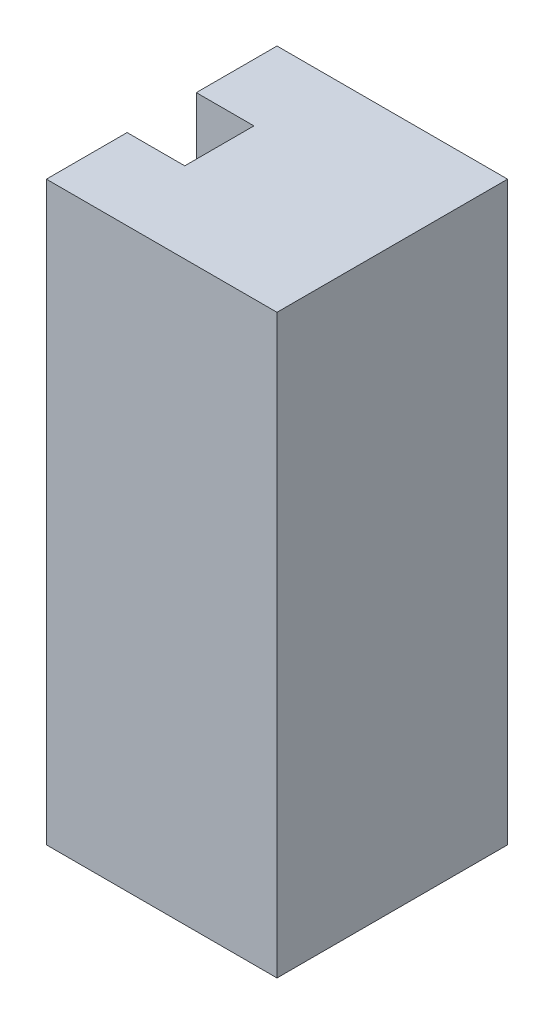
ISO-10303-21;
HEADER;
FILE_DESCRIPTION(('STEP AP214'),'2;1');
FILE_NAME('part.step','',(''),(''),'','','');
FILE_SCHEMA(('AUTOMOTIVE_DESIGN { 1 0 10303 214 1 1 1 1 }'));
ENDSEC;
DATA;
#1=APPLICATION_CONTEXT('core data for automotive mechanical design processes');
#2=APPLICATION_PROTOCOL_DEFINITION('international standard','automotive_design',2000,#1);
#3=PRODUCT_CONTEXT('',#1,'mechanical');
#4=PRODUCT('Part','Part','',(#3));
#5=PRODUCT_RELATED_PRODUCT_CATEGORY('part','',(#4));
#6=PRODUCT_DEFINITION_FORMATION('','',#4);
#7=PRODUCT_DEFINITION_CONTEXT('part definition',#1,'design');
#8=PRODUCT_DEFINITION('design','',#6,#7);
#9=PRODUCT_DEFINITION_SHAPE('','',#8);
#10=(LENGTH_UNIT() NAMED_UNIT(*) SI_UNIT(.MILLI.,.METRE.));
#11=(NAMED_UNIT(*) PLANE_ANGLE_UNIT() SI_UNIT($,.RADIAN.));
#12=(NAMED_UNIT(*) SI_UNIT($,.STERADIAN.) SOLID_ANGLE_UNIT());
#13=UNCERTAINTY_MEASURE_WITH_UNIT(LENGTH_MEASURE(1.E-05),#10,'distance_accuracy_value','');
#14=(GEOMETRIC_REPRESENTATION_CONTEXT(3) GLOBAL_UNCERTAINTY_ASSIGNED_CONTEXT((#13)) GLOBAL_UNIT_ASSIGNED_CONTEXT((#10,
#11,#12)) REPRESENTATION_CONTEXT('',''));
#15=CARTESIAN_POINT('',(0.,0.,0.));
#16=DIRECTION('',(0.,0.,1.));
#17=DIRECTION('',(1.,0.,0.));
#18=AXIS2_PLACEMENT_3D('',#15,#16,#17);
#19=CARTESIAN_POINT('',(-8.77887788778878,50.,-3.86138613861386));
#20=DIRECTION('',(1.,0.,0.));
#21=DIRECTION('',(0.,0.,-1.));
#22=AXIS2_PLACEMENT_3D('',#19,#20,#21);
#23=PLANE('',#22);
#24=DIRECTION('',(0.,0.,1.));
#25=VECTOR('',#24,1.);
#26=CARTESIAN_POINT('',(-8.77887788778878,50.,-3.86138613861386));
#27=LINE('',#26,#25);
#28=CARTESIAN_POINT('',(-8.77887788778878,50.,9.13861386138614));
#29=VERTEX_POINT('',#28);
#30=CARTESIAN_POINT('',(-8.77887788778877,50.,16.1386138613861));
#31=VERTEX_POINT('',#30);
#32=EDGE_CURVE('E91',#29,#31,#27,.T.);
#33=ORIENTED_EDGE('',*,*,#32,.F.);
#34=DIRECTION('',(0.,1.,0.));
#35=VECTOR('',#34,1.);
#36=CARTESIAN_POINT('',(-8.77887788778878,50.,9.13861386138614));
#37=LINE('',#36,#35);
#38=CARTESIAN_POINT('',(-8.77887788778878,0.,9.13861386138614));
#39=VERTEX_POINT('',#38);
#40=EDGE_CURVE('E118',#39,#29,#37,.T.);
#41=ORIENTED_EDGE('',*,*,#40,.F.);
#42=DIRECTION('',(0.,0.,1.));
#43=VECTOR('',#42,1.);
#44=CARTESIAN_POINT('',(-8.77887788778878,0.,-3.86138613861386));
#45=LINE('',#44,#43);
#46=CARTESIAN_POINT('',(-8.77887788778877,0.,16.1386138613861));
#47=VERTEX_POINT('',#46);
#48=EDGE_CURVE('E139',#39,#47,#45,.T.);
#49=ORIENTED_EDGE('',*,*,#48,.T.);
#50=DIRECTION('',(0.,-1.,0.));
#51=VECTOR('',#50,1.);
#52=CARTESIAN_POINT('',(-8.77887788778877,50.,16.1386138613861));
#53=LINE('',#52,#51);
#54=EDGE_CURVE('E11',#31,#47,#53,.T.);
#55=ORIENTED_EDGE('',*,*,#54,.F.);
#56=EDGE_LOOP('',(#33,#41,#49,#55));
#57=FACE_BOUND('',#56,.T.);
#58=ADVANCED_FACE('F39',(#57),#23,.F.);
#59=CARTESIAN_POINT('',(-8.77887788778878,0.,-3.86138613861386));
#60=VERTEX_POINT('',#59);
#61=CARTESIAN_POINT('',(-8.77887788778878,0.,3.13861386138614));
#62=VERTEX_POINT('',#61);
#63=EDGE_CURVE('E152',#60,#62,#45,.T.);
#64=ORIENTED_EDGE('',*,*,#63,.T.);
#65=DIRECTION('',(0.,-1.,0.));
#66=VECTOR('',#65,1.);
#67=CARTESIAN_POINT('',(-8.77887788778878,50.,3.13861386138614));
#68=LINE('',#67,#66);
#69=CARTESIAN_POINT('',(-8.77887788778878,50.,3.13861386138614));
#70=VERTEX_POINT('',#69);
#71=EDGE_CURVE('E128',#70,#62,#68,.T.);
#72=ORIENTED_EDGE('',*,*,#71,.F.);
#73=CARTESIAN_POINT('',(-8.77887788778878,50.,-3.86138613861386));
#74=VERTEX_POINT('',#73);
#75=EDGE_CURVE('E144',#74,#70,#27,.T.);
#76=ORIENTED_EDGE('',*,*,#75,.F.);
#77=DIRECTION('',(0.,-1.,0.));
#78=VECTOR('',#77,1.);
#79=CARTESIAN_POINT('',(-8.77887788778878,50.,-3.86138613861386));
#80=LINE('',#79,#78);
#81=EDGE_CURVE('E151',#74,#60,#80,.T.);
#82=ORIENTED_EDGE('',*,*,#81,.T.);
#83=EDGE_LOOP('',(#64,#72,#76,#82));
#84=FACE_BOUND('',#83,.T.);
#85=ADVANCED_FACE('F41',(#84),#23,.F.);
#86=CARTESIAN_POINT('',(-8.77887788778877,50.,16.1386138613861));
#87=DIRECTION('',(0.,0.,-1.));
#88=DIRECTION('',(-1.,0.,0.));
#89=AXIS2_PLACEMENT_3D('',#86,#87,#88);
#90=PLANE('',#89);
#91=DIRECTION('',(1.,0.,0.));
#92=VECTOR('',#91,1.);
#93=CARTESIAN_POINT('',(-8.77887788778877,0.,16.1386138613861));
#94=LINE('',#93,#92);
#95=CARTESIAN_POINT('',(11.2211221122112,0.,16.1386138613861));
#96=VERTEX_POINT('',#95);
#97=EDGE_CURVE('E155',#47,#96,#94,.T.);
#98=ORIENTED_EDGE('',*,*,#97,.T.);
#99=DIRECTION('',(0.,-1.,0.));
#100=VECTOR('',#99,1.);
#101=CARTESIAN_POINT('',(11.2211221122112,50.,16.1386138613861));
#102=LINE('',#101,#100);
#103=CARTESIAN_POINT('',(11.2211221122112,50.,16.1386138613861));
#104=VERTEX_POINT('',#103);
#105=EDGE_CURVE('E47',#104,#96,#102,.T.);
#106=ORIENTED_EDGE('',*,*,#105,.F.);
#107=DIRECTION('',(1.,0.,0.));
#108=VECTOR('',#107,1.);
#109=CARTESIAN_POINT('',(-8.77887788778877,50.,16.1386138613861));
#110=LINE('',#109,#108);
#111=EDGE_CURVE('E146',#31,#104,#110,.T.);
#112=ORIENTED_EDGE('',*,*,#111,.F.);
#113=ORIENTED_EDGE('',*,*,#54,.T.);
#114=EDGE_LOOP('',(#98,#106,#112,#113));
#115=FACE_BOUND('',#114,.T.);
#116=ADVANCED_FACE('F187',(#115),#90,.F.);
#117=CARTESIAN_POINT('',(11.2211221122112,50.,-3.86138613861386));
#118=DIRECTION('',(-1.,0.,0.));
#119=DIRECTION('',(0.,0.,1.));
#120=AXIS2_PLACEMENT_3D('',#117,#118,#119);
#121=PLANE('',#120);
#122=DIRECTION('',(0.,0.,-1.));
#123=VECTOR('',#122,1.);
#124=CARTESIAN_POINT('',(11.2211221122112,0.,-3.86138613861386));
#125=LINE('',#124,#123);
#126=CARTESIAN_POINT('',(11.2211221122112,0.,-3.86138613861386));
#127=VERTEX_POINT('',#126);
#128=EDGE_CURVE('E157',#96,#127,#125,.T.);
#129=ORIENTED_EDGE('',*,*,#128,.T.);
#130=DIRECTION('',(0.,-1.,0.));
#131=VECTOR('',#130,1.);
#132=CARTESIAN_POINT('',(11.2211221122112,50.,-3.86138613861386));
#133=LINE('',#132,#131);
#134=CARTESIAN_POINT('',(11.2211221122112,50.,-3.86138613861386));
#135=VERTEX_POINT('',#134);
#136=EDGE_CURVE('E161',#135,#127,#133,.T.);
#137=ORIENTED_EDGE('',*,*,#136,.F.);
#138=DIRECTION('',(0.,0.,-1.));
#139=VECTOR('',#138,1.);
#140=CARTESIAN_POINT('',(11.2211221122112,50.,-3.86138613861386));
#141=LINE('',#140,#139);
#142=EDGE_CURVE('E148',#104,#135,#141,.T.);
#143=ORIENTED_EDGE('',*,*,#142,.F.);
#144=ORIENTED_EDGE('',*,*,#105,.T.);
#145=EDGE_LOOP('',(#129,#137,#143,#144));
#146=FACE_BOUND('',#145,.T.);
#147=ADVANCED_FACE('F167',(#146),#121,.F.);
#148=CARTESIAN_POINT('',(-8.77887788778878,50.,-3.86138613861386));
#149=DIRECTION('',(0.,0.,1.));
#150=DIRECTION('',(1.,0.,0.));
#151=AXIS2_PLACEMENT_3D('',#148,#149,#150);
#152=PLANE('',#151);
#153=DIRECTION('',(-1.,0.,0.));
#154=VECTOR('',#153,1.);
#155=CARTESIAN_POINT('',(-8.77887788778878,0.,-3.86138613861386));
#156=LINE('',#155,#154);
#157=EDGE_CURVE('E84',#127,#60,#156,.T.);
#158=ORIENTED_EDGE('',*,*,#157,.T.);
#159=ORIENTED_EDGE('',*,*,#81,.F.);
#160=DIRECTION('',(-1.,0.,0.));
#161=VECTOR('',#160,1.);
#162=CARTESIAN_POINT('',(-8.77887788778878,50.,-3.86138613861386));
#163=LINE('',#162,#161);
#164=EDGE_CURVE('E63',#135,#74,#163,.T.);
#165=ORIENTED_EDGE('',*,*,#164,.F.);
#166=ORIENTED_EDGE('',*,*,#136,.T.);
#167=EDGE_LOOP('',(#158,#159,#165,#166));
#168=FACE_BOUND('',#167,.T.);
#169=ADVANCED_FACE('F178',(#168),#152,.F.);
#170=CARTESIAN_POINT('',(0.,50.,0.));
#171=DIRECTION('',(0.,1.,0.));
#172=DIRECTION('',(0.,0.,1.));
#173=AXIS2_PLACEMENT_3D('',#170,#171,#172);
#174=PLANE('',#173);
#175=DIRECTION('',(-1.,0.,0.));
#176=VECTOR('',#175,1.);
#177=CARTESIAN_POINT('',(-3.77887788778878,50.,9.13861386138614));
#178=LINE('',#177,#176);
#179=CARTESIAN_POINT('',(-3.77887788778878,50.,9.13861386138614));
#180=VERTEX_POINT('',#179);
#181=EDGE_CURVE('E113',#180,#29,#178,.T.);
#182=ORIENTED_EDGE('',*,*,#181,.T.);
#183=ORIENTED_EDGE('',*,*,#32,.T.);
#184=ORIENTED_EDGE('',*,*,#111,.T.);
#185=ORIENTED_EDGE('',*,*,#142,.T.);
#186=ORIENTED_EDGE('',*,*,#164,.T.);
#187=ORIENTED_EDGE('',*,*,#75,.T.);
#188=DIRECTION('',(-1.,0.,0.));
#189=VECTOR('',#188,1.);
#190=CARTESIAN_POINT('',(-3.77887788778878,50.,3.13861386138614));
#191=LINE('',#190,#189);
#192=CARTESIAN_POINT('',(-3.77887788778878,50.,3.13861386138614));
#193=VERTEX_POINT('',#192);
#194=EDGE_CURVE('E120',#193,#70,#191,.T.);
#195=ORIENTED_EDGE('',*,*,#194,.F.);
#196=DIRECTION('',(0.,0.,-1.));
#197=VECTOR('',#196,1.);
#198=CARTESIAN_POINT('',(-3.77887788778878,50.,3.13861386138614));
#199=LINE('',#198,#197);
#200=EDGE_CURVE('E124',#180,#193,#199,.T.);
#201=ORIENTED_EDGE('',*,*,#200,.F.);
#202=EDGE_LOOP('',(#182,#183,#184,#185,#186,#187,#195,#201));
#203=FACE_BOUND('',#202,.T.);
#204=ADVANCED_FACE('F130',(#203),#174,.T.);
#205=CARTESIAN_POINT('',(0.,0.,0.));
#206=DIRECTION('',(0.,1.,0.));
#207=DIRECTION('',(0.,0.,1.));
#208=AXIS2_PLACEMENT_3D('',#205,#206,#207);
#209=PLANE('',#208);
#210=ORIENTED_EDGE('',*,*,#48,.F.);
#211=DIRECTION('',(-1.,0.,0.));
#212=VECTOR('',#211,1.);
#213=CARTESIAN_POINT('',(-3.77887788778878,0.,9.13861386138614));
#214=LINE('',#213,#212);
#215=CARTESIAN_POINT('',(-3.77887788778878,0.,9.13861386138614));
#216=VERTEX_POINT('',#215);
#217=EDGE_CURVE('E137',#216,#39,#214,.T.);
#218=ORIENTED_EDGE('',*,*,#217,.F.);
#219=DIRECTION('',(0.,0.,1.));
#220=VECTOR('',#219,1.);
#221=CARTESIAN_POINT('',(-3.77887788778878,0.,3.13861386138614));
#222=LINE('',#221,#220);
#223=CARTESIAN_POINT('',(-3.77887788778878,0.,3.13861386138614));
#224=VERTEX_POINT('',#223);
#225=EDGE_CURVE('E121',#224,#216,#222,.T.);
#226=ORIENTED_EDGE('',*,*,#225,.F.);
#227=DIRECTION('',(-1.,0.,0.));
#228=VECTOR('',#227,1.);
#229=CARTESIAN_POINT('',(-3.77887788778878,0.,3.13861386138614));
#230=LINE('',#229,#228);
#231=EDGE_CURVE('E140',#224,#62,#230,.T.);
#232=ORIENTED_EDGE('',*,*,#231,.T.);
#233=ORIENTED_EDGE('',*,*,#63,.F.);
#234=ORIENTED_EDGE('',*,*,#157,.F.);
#235=ORIENTED_EDGE('',*,*,#128,.F.);
#236=ORIENTED_EDGE('',*,*,#97,.F.);
#237=EDGE_LOOP('',(#210,#218,#226,#232,#233,#234,#235,#236));
#238=FACE_BOUND('',#237,.T.);
#239=ADVANCED_FACE('F173',(#238),#209,.F.);
#240=CARTESIAN_POINT('',(-3.77887788778878,50.,9.13861386138614));
#241=DIRECTION('',(0.,0.,1.));
#242=DIRECTION('',(1.,0.,0.));
#243=AXIS2_PLACEMENT_3D('',#240,#241,#242);
#244=PLANE('',#243);
#245=ORIENTED_EDGE('',*,*,#40,.T.);
#246=ORIENTED_EDGE('',*,*,#181,.F.);
#247=DIRECTION('',(0.,1.,0.));
#248=VECTOR('',#247,1.);
#249=CARTESIAN_POINT('',(-3.77887788778878,50.,9.13861386138614));
#250=LINE('',#249,#248);
#251=EDGE_CURVE('E116',#216,#180,#250,.T.);
#252=ORIENTED_EDGE('',*,*,#251,.F.);
#253=ORIENTED_EDGE('',*,*,#217,.T.);
#254=EDGE_LOOP('',(#245,#246,#252,#253));
#255=FACE_BOUND('',#254,.T.);
#256=ADVANCED_FACE('F115',(#255),#244,.F.);
#257=CARTESIAN_POINT('',(-3.77887788778878,50.,3.13861386138614));
#258=DIRECTION('',(0.,0.,-1.));
#259=DIRECTION('',(-1.,0.,0.));
#260=AXIS2_PLACEMENT_3D('',#257,#258,#259);
#261=PLANE('',#260);
#262=ORIENTED_EDGE('',*,*,#71,.T.);
#263=ORIENTED_EDGE('',*,*,#231,.F.);
#264=DIRECTION('',(0.,-1.,0.));
#265=VECTOR('',#264,1.);
#266=CARTESIAN_POINT('',(-3.77887788778878,50.,3.13861386138614));
#267=LINE('',#266,#265);
#268=EDGE_CURVE('E54',#193,#224,#267,.T.);
#269=ORIENTED_EDGE('',*,*,#268,.F.);
#270=ORIENTED_EDGE('',*,*,#194,.T.);
#271=EDGE_LOOP('',(#262,#263,#269,#270));
#272=FACE_BOUND('',#271,.T.);
#273=ADVANCED_FACE('F234',(#272),#261,.F.);
#274=CARTESIAN_POINT('',(-3.77887788778878,0.,0.));
#275=DIRECTION('',(-1.,0.,0.));
#276=DIRECTION('',(0.,0.,1.));
#277=AXIS2_PLACEMENT_3D('',#274,#275,#276);
#278=PLANE('',#277);
#279=ORIENTED_EDGE('',*,*,#251,.T.);
#280=ORIENTED_EDGE('',*,*,#200,.T.);
#281=ORIENTED_EDGE('',*,*,#268,.T.);
#282=ORIENTED_EDGE('',*,*,#225,.T.);
#283=EDGE_LOOP('',(#279,#280,#281,#282));
#284=FACE_BOUND('',#283,.T.);
#285=ADVANCED_FACE('F123',(#284),#278,.T.);
#286=CLOSED_SHELL('',(#58,#85,#116,#147,#169,#204,#239,#256,#273,#285));
#287=MANIFOLD_SOLID_BREP('B2',#286);
#288=ADVANCED_BREP_SHAPE_REPRESENTATION('',(#18,#287),#14);
#289=SHAPE_DEFINITION_REPRESENTATION(#9,#288);
ENDSEC;
END-ISO-10303-21;
